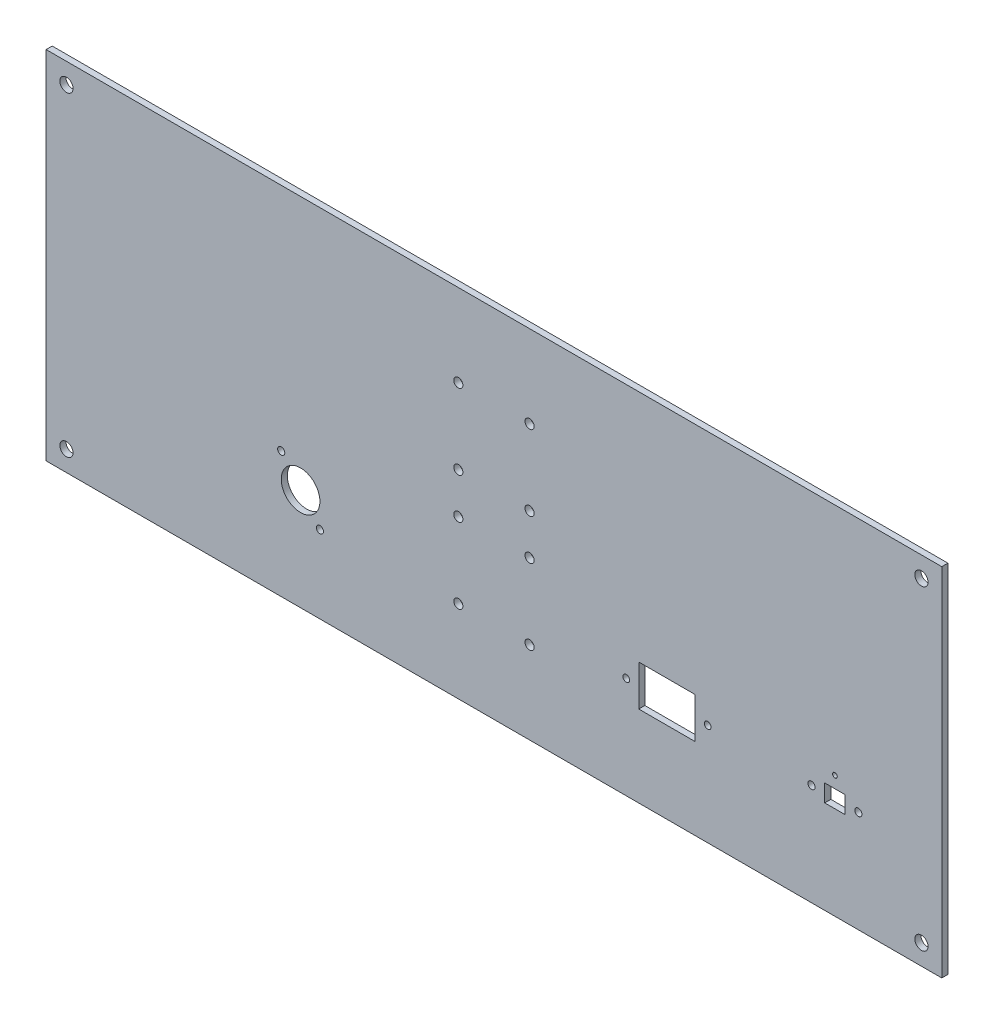
ISO-10303-21;
HEADER;
FILE_DESCRIPTION(('STEP AP214'),'2;1');
FILE_NAME('part.step','',(''),(''),'','','');
FILE_SCHEMA(('AUTOMOTIVE_DESIGN { 1 0 10303 214 1 1 1 1 }'));
ENDSEC;
DATA;
#1=APPLICATION_CONTEXT('core data for automotive mechanical design processes');
#2=APPLICATION_PROTOCOL_DEFINITION('international standard','automotive_design',2000,#1);
#3=PRODUCT_CONTEXT('',#1,'mechanical');
#4=PRODUCT('Part','Part','',(#3));
#5=PRODUCT_RELATED_PRODUCT_CATEGORY('part','',(#4));
#6=PRODUCT_DEFINITION_FORMATION('','',#4);
#7=PRODUCT_DEFINITION_CONTEXT('part definition',#1,'design');
#8=PRODUCT_DEFINITION('design','',#6,#7);
#9=PRODUCT_DEFINITION_SHAPE('','',#8);
#10=(LENGTH_UNIT() NAMED_UNIT(*) SI_UNIT(.MILLI.,.METRE.));
#11=(NAMED_UNIT(*) PLANE_ANGLE_UNIT() SI_UNIT($,.RADIAN.));
#12=(NAMED_UNIT(*) SI_UNIT($,.STERADIAN.) SOLID_ANGLE_UNIT());
#13=UNCERTAINTY_MEASURE_WITH_UNIT(LENGTH_MEASURE(1.E-05),#10,'distance_accuracy_value','');
#14=(GEOMETRIC_REPRESENTATION_CONTEXT(3) GLOBAL_UNCERTAINTY_ASSIGNED_CONTEXT((#13)) GLOBAL_UNIT_ASSIGNED_CONTEXT((#10,
#11,#12)) REPRESENTATION_CONTEXT('',''));
#15=CARTESIAN_POINT('',(0.,0.,0.));
#16=DIRECTION('',(0.,0.,1.));
#17=DIRECTION('',(1.,0.,0.));
#18=AXIS2_PLACEMENT_3D('',#15,#16,#17);
#19=CARTESIAN_POINT('',(0.,0.,3.));
#20=DIRECTION('',(0.,0.,-1.));
#21=DIRECTION('',(-1.,0.,0.));
#22=AXIS2_PLACEMENT_3D('',#19,#20,#21);
#23=PLANE('',#22);
#24=CARTESIAN_POINT('',(325.,50.,3.));
#25=DIRECTION('',(0.,0.,1.));
#26=DIRECTION('',(1.,0.,0.));
#27=AXIS2_PLACEMENT_3D('',#24,#25,#26);
#28=CIRCLE('',#27,1.64999999999999);
#29=CARTESIAN_POINT('',(326.65,50.,3.));
#30=VERTEX_POINT('',#29);
#31=EDGE_CURVE('E164',#30,#30,#28,.T.);
#32=ORIENTED_EDGE('',*,*,#31,.F.);
#33=EDGE_LOOP('',(#32));
#34=FACE_BOUND('',#33,.T.);
#35=CARTESIAN_POINT('',(285.,50.,3.));
#36=DIRECTION('',(0.,0.,1.));
#37=DIRECTION('',(1.,0.,0.));
#38=AXIS2_PLACEMENT_3D('',#35,#36,#37);
#39=CIRCLE('',#38,1.64999999999999);
#40=CARTESIAN_POINT('',(286.65,50.,3.));
#41=VERTEX_POINT('',#40);
#42=EDGE_CURVE('E170',#41,#41,#39,.T.);
#43=ORIENTED_EDGE('',*,*,#42,.F.);
#44=EDGE_LOOP('',(#43));
#45=FACE_BOUND('',#44,.T.);
#46=CARTESIAN_POINT('',(134.5,38.,3.));
#47=DIRECTION('',(0.,0.,1.));
#48=DIRECTION('',(1.,0.,0.));
#49=AXIS2_PLACEMENT_3D('',#46,#47,#48);
#50=CIRCLE('',#49,1.75000000000001);
#51=CARTESIAN_POINT('',(136.25,38.,3.));
#52=VERTEX_POINT('',#51);
#53=EDGE_CURVE('E176',#52,#52,#50,.T.);
#54=ORIENTED_EDGE('',*,*,#53,.F.);
#55=EDGE_LOOP('',(#54));
#56=FACE_BOUND('',#55,.T.);
#57=CARTESIAN_POINT('',(115.5,62.,3.));
#58=DIRECTION('',(0.,0.,1.));
#59=DIRECTION('',(1.,0.,0.));
#60=AXIS2_PLACEMENT_3D('',#57,#58,#59);
#61=CIRCLE('',#60,1.75);
#62=CARTESIAN_POINT('',(117.25,62.,3.));
#63=VERTEX_POINT('',#62);
#64=EDGE_CURVE('E182',#63,#63,#61,.T.);
#65=ORIENTED_EDGE('',*,*,#64,.F.);
#66=EDGE_LOOP('',(#65));
#67=FACE_BOUND('',#66,.T.);
#68=DIRECTION('',(0.,1.,0.));
#69=VECTOR('',#68,1.);
#70=CARTESIAN_POINT('',(318.85,40.,3.));
#71=LINE('',#70,#69);
#72=CARTESIAN_POINT('',(318.85,40.,3.));
#73=VERTEX_POINT('',#72);
#74=CARTESIAN_POINT('',(318.85,60.,3.));
#75=VERTEX_POINT('',#74);
#76=EDGE_CURVE('E188',#73,#75,#71,.T.);
#77=ORIENTED_EDGE('',*,*,#76,.F.);
#78=DIRECTION('',(1.,0.,0.));
#79=VECTOR('',#78,1.);
#80=CARTESIAN_POINT('',(291.15,40.,3.));
#81=LINE('',#80,#79);
#82=CARTESIAN_POINT('',(291.15,40.,3.));
#83=VERTEX_POINT('',#82);
#84=EDGE_CURVE('E196',#83,#73,#81,.T.);
#85=ORIENTED_EDGE('',*,*,#84,.F.);
#86=DIRECTION('',(0.,-1.,0.));
#87=VECTOR('',#86,1.);
#88=CARTESIAN_POINT('',(291.15,40.,3.));
#89=LINE('',#88,#87);
#90=CARTESIAN_POINT('',(291.15,60.,3.));
#91=VERTEX_POINT('',#90);
#92=EDGE_CURVE('E193',#91,#83,#89,.T.);
#93=ORIENTED_EDGE('',*,*,#92,.F.);
#94=DIRECTION('',(-1.,0.,0.));
#95=VECTOR('',#94,1.);
#96=CARTESIAN_POINT('',(291.15,60.,3.));
#97=LINE('',#96,#95);
#98=EDGE_CURVE('E190',#75,#91,#97,.T.);
#99=ORIENTED_EDGE('',*,*,#98,.F.);
#100=EDGE_LOOP('',(#77,#85,#93,#99));
#101=FACE_BOUND('',#100,.T.);
#102=DIRECTION('',(0.,-1.,0.));
#103=VECTOR('',#102,1.);
#104=CARTESIAN_POINT('',(0.,0.,3.));
#105=LINE('',#104,#103);
#106=CARTESIAN_POINT('',(0.,175.,3.));
#107=VERTEX_POINT('',#106);
#108=CARTESIAN_POINT('',(0.,0.,3.));
#109=VERTEX_POINT('',#108);
#110=EDGE_CURVE('E225',#107,#109,#105,.T.);
#111=ORIENTED_EDGE('',*,*,#110,.T.);
#112=DIRECTION('',(1.,0.,0.));
#113=VECTOR('',#112,1.);
#114=CARTESIAN_POINT('',(0.,0.,3.));
#115=LINE('',#114,#113);
#116=CARTESIAN_POINT('',(440.,0.,3.));
#117=VERTEX_POINT('',#116);
#118=EDGE_CURVE('E228',#109,#117,#115,.T.);
#119=ORIENTED_EDGE('',*,*,#118,.T.);
#120=DIRECTION('',(0.,1.,0.));
#121=VECTOR('',#120,1.);
#122=CARTESIAN_POINT('',(440.,0.,3.));
#123=LINE('',#122,#121);
#124=CARTESIAN_POINT('',(440.,175.,3.));
#125=VERTEX_POINT('',#124);
#126=EDGE_CURVE('E231',#117,#125,#123,.T.);
#127=ORIENTED_EDGE('',*,*,#126,.T.);
#128=DIRECTION('',(-1.,0.,0.));
#129=VECTOR('',#128,1.);
#130=CARTESIAN_POINT('',(0.,175.,3.));
#131=LINE('',#130,#129);
#132=EDGE_CURVE('E234',#125,#107,#131,.T.);
#133=ORIENTED_EDGE('',*,*,#132,.T.);
#134=EDGE_LOOP('',(#111,#119,#127,#133));
#135=FACE_BOUND('',#134,.T.);
#136=CARTESIAN_POINT('',(125.,50.,3.));
#137=DIRECTION('',(0.,0.,1.));
#138=DIRECTION('',(1.,0.,0.));
#139=AXIS2_PLACEMENT_3D('',#136,#137,#138);
#140=CIRCLE('',#139,9.50000000000001);
#141=CARTESIAN_POINT('',(134.5,50.,3.));
#142=VERTEX_POINT('',#141);
#143=EDGE_CURVE('E219',#142,#142,#140,.T.);
#144=ORIENTED_EDGE('',*,*,#143,.F.);
#145=EDGE_LOOP('',(#144));
#146=FACE_BOUND('',#145,.T.);
#147=DIRECTION('',(0.,1.,0.));
#148=VECTOR('',#147,1.);
#149=CARTESIAN_POINT('',(392.5,45.75,3.));
#150=LINE('',#149,#148);
#151=CARTESIAN_POINT('',(392.5,45.75,3.));
#152=VERTEX_POINT('',#151);
#153=CARTESIAN_POINT('',(392.5,54.25,3.));
#154=VERTEX_POINT('',#153);
#155=EDGE_CURVE('E125',#152,#154,#150,.T.);
#156=ORIENTED_EDGE('',*,*,#155,.F.);
#157=DIRECTION('',(1.,0.,0.));
#158=VECTOR('',#157,1.);
#159=CARTESIAN_POINT('',(382.5,45.75,3.));
#160=LINE('',#159,#158);
#161=CARTESIAN_POINT('',(382.5,45.75,3.));
#162=VERTEX_POINT('',#161);
#163=EDGE_CURVE('E148',#162,#152,#160,.T.);
#164=ORIENTED_EDGE('',*,*,#163,.F.);
#165=DIRECTION('',(0.,-1.,0.));
#166=VECTOR('',#165,1.);
#167=CARTESIAN_POINT('',(382.5,45.75,3.));
#168=LINE('',#167,#166);
#169=CARTESIAN_POINT('',(382.5,54.25,3.));
#170=VERTEX_POINT('',#169);
#171=EDGE_CURVE('E146',#170,#162,#168,.T.);
#172=ORIENTED_EDGE('',*,*,#171,.F.);
#173=DIRECTION('',(-1.,0.,0.));
#174=VECTOR('',#173,1.);
#175=CARTESIAN_POINT('',(382.5,54.25,3.));
#176=LINE('',#175,#174);
#177=EDGE_CURVE('E133',#154,#170,#176,.T.);
#178=ORIENTED_EDGE('',*,*,#177,.F.);
#179=EDGE_LOOP('',(#156,#164,#172,#178));
#180=FACE_BOUND('',#179,.T.);
#181=CARTESIAN_POINT('',(387.5,60.,3.));
#182=DIRECTION('',(0.,0.,1.));
#183=DIRECTION('',(1.,0.,0.));
#184=AXIS2_PLACEMENT_3D('',#181,#182,#183);
#185=CIRCLE('',#184,1.14999999999996);
#186=CARTESIAN_POINT('',(388.65,60.,3.));
#187=VERTEX_POINT('',#186);
#188=EDGE_CURVE('E154',#187,#187,#185,.T.);
#189=ORIENTED_EDGE('',*,*,#188,.F.);
#190=EDGE_LOOP('',(#189));
#191=FACE_BOUND('',#190,.T.);
#192=CARTESIAN_POINT('',(376.,50.,3.));
#193=DIRECTION('',(0.,0.,1.));
#194=DIRECTION('',(1.,0.,0.));
#195=AXIS2_PLACEMENT_3D('',#192,#193,#194);
#196=CIRCLE('',#195,1.74999999999998);
#197=CARTESIAN_POINT('',(377.75,50.,3.));
#198=VERTEX_POINT('',#197);
#199=EDGE_CURVE('E492',#198,#198,#196,.T.);
#200=ORIENTED_EDGE('',*,*,#199,.F.);
#201=EDGE_LOOP('',(#200));
#202=FACE_BOUND('',#201,.T.);
#203=CARTESIAN_POINT('',(399.,50.,3.));
#204=DIRECTION('',(0.,0.,1.));
#205=DIRECTION('',(1.,0.,0.));
#206=AXIS2_PLACEMENT_3D('',#203,#204,#205);
#207=CIRCLE('',#206,1.74999999999998);
#208=CARTESIAN_POINT('',(400.75,50.,3.));
#209=VERTEX_POINT('',#208);
#210=EDGE_CURVE('E486',#209,#209,#207,.T.);
#211=ORIENTED_EDGE('',*,*,#210,.F.);
#212=EDGE_LOOP('',(#211));
#213=FACE_BOUND('',#212,.T.);
#214=CARTESIAN_POINT('',(10.,165.,3.));
#215=DIRECTION('',(0.,0.,1.));
#216=DIRECTION('',(1.,0.,0.));
#217=AXIS2_PLACEMENT_3D('',#214,#215,#216);
#218=CIRCLE('',#217,3.25);
#219=CARTESIAN_POINT('',(13.25,165.,3.));
#220=VERTEX_POINT('',#219);
#221=EDGE_CURVE('E480',#220,#220,#218,.T.);
#222=ORIENTED_EDGE('',*,*,#221,.F.);
#223=EDGE_LOOP('',(#222));
#224=FACE_BOUND('',#223,.T.);
#225=CARTESIAN_POINT('',(10.,10.,3.));
#226=DIRECTION('',(0.,0.,1.));
#227=DIRECTION('',(1.,0.,0.));
#228=AXIS2_PLACEMENT_3D('',#225,#226,#227);
#229=CIRCLE('',#228,3.25);
#230=CARTESIAN_POINT('',(13.25,10.,3.));
#231=VERTEX_POINT('',#230);
#232=EDGE_CURVE('E474',#231,#231,#229,.T.);
#233=ORIENTED_EDGE('',*,*,#232,.F.);
#234=EDGE_LOOP('',(#233));
#235=FACE_BOUND('',#234,.T.);
#236=CARTESIAN_POINT('',(430.,10.,3.));
#237=DIRECTION('',(0.,0.,1.));
#238=DIRECTION('',(1.,0.,0.));
#239=AXIS2_PLACEMENT_3D('',#236,#237,#238);
#240=CIRCLE('',#239,3.25000000000001);
#241=CARTESIAN_POINT('',(433.25,10.,3.));
#242=VERTEX_POINT('',#241);
#243=EDGE_CURVE('E468',#242,#242,#240,.T.);
#244=ORIENTED_EDGE('',*,*,#243,.F.);
#245=EDGE_LOOP('',(#244));
#246=FACE_BOUND('',#245,.T.);
#247=CARTESIAN_POINT('',(430.,165.,3.));
#248=DIRECTION('',(0.,0.,1.));
#249=DIRECTION('',(1.,0.,0.));
#250=AXIS2_PLACEMENT_3D('',#247,#248,#249);
#251=CIRCLE('',#250,3.25000000000001);
#252=CARTESIAN_POINT('',(433.25,165.,3.));
#253=VERTEX_POINT('',#252);
#254=EDGE_CURVE('E462',#253,#253,#251,.T.);
#255=ORIENTED_EDGE('',*,*,#254,.F.);
#256=EDGE_LOOP('',(#255));
#257=FACE_BOUND('',#256,.T.);
#258=CARTESIAN_POINT('',(202.5,134.5,3.));
#259=DIRECTION('',(0.,0.,1.));
#260=DIRECTION('',(1.,0.,0.));
#261=AXIS2_PLACEMENT_3D('',#258,#259,#260);
#262=CIRCLE('',#261,2.25000000000001);
#263=CARTESIAN_POINT('',(204.75,134.5,3.));
#264=VERTEX_POINT('',#263);
#265=EDGE_CURVE('E456',#264,#264,#262,.T.);
#266=ORIENTED_EDGE('',*,*,#265,.F.);
#267=EDGE_LOOP('',(#266));
#268=FACE_BOUND('',#267,.T.);
#269=CARTESIAN_POINT('',(202.5,97.5,3.));
#270=DIRECTION('',(0.,0.,1.));
#271=DIRECTION('',(1.,0.,0.));
#272=AXIS2_PLACEMENT_3D('',#269,#270,#271);
#273=CIRCLE('',#272,2.25000000000001);
#274=CARTESIAN_POINT('',(204.75,97.5,3.));
#275=VERTEX_POINT('',#274);
#276=EDGE_CURVE('E450',#275,#275,#273,.T.);
#277=ORIENTED_EDGE('',*,*,#276,.F.);
#278=EDGE_LOOP('',(#277));
#279=FACE_BOUND('',#278,.T.);
#280=CARTESIAN_POINT('',(237.5,134.5,3.));
#281=DIRECTION('',(0.,0.,1.));
#282=DIRECTION('',(1.,0.,0.));
#283=AXIS2_PLACEMENT_3D('',#280,#281,#282);
#284=CIRCLE('',#283,2.25000000000001);
#285=CARTESIAN_POINT('',(239.75,134.5,3.));
#286=VERTEX_POINT('',#285);
#287=EDGE_CURVE('E444',#286,#286,#284,.T.);
#288=ORIENTED_EDGE('',*,*,#287,.F.);
#289=EDGE_LOOP('',(#288));
#290=FACE_BOUND('',#289,.T.);
#291=CARTESIAN_POINT('',(237.5,97.5,3.));
#292=DIRECTION('',(0.,0.,1.));
#293=DIRECTION('',(1.,0.,0.));
#294=AXIS2_PLACEMENT_3D('',#291,#292,#293);
#295=CIRCLE('',#294,2.25000000000001);
#296=CARTESIAN_POINT('',(239.75,97.5,3.));
#297=VERTEX_POINT('',#296);
#298=EDGE_CURVE('E438',#297,#297,#295,.T.);
#299=ORIENTED_EDGE('',*,*,#298,.F.);
#300=EDGE_LOOP('',(#299));
#301=FACE_BOUND('',#300,.T.);
#302=CARTESIAN_POINT('',(237.5,77.5,3.));
#303=DIRECTION('',(0.,0.,1.));
#304=DIRECTION('',(1.,0.,0.));
#305=AXIS2_PLACEMENT_3D('',#302,#303,#304);
#306=CIRCLE('',#305,2.25000000000001);
#307=CARTESIAN_POINT('',(239.75,77.5,3.));
#308=VERTEX_POINT('',#307);
#309=EDGE_CURVE('E432',#308,#308,#306,.T.);
#310=ORIENTED_EDGE('',*,*,#309,.F.);
#311=EDGE_LOOP('',(#310));
#312=FACE_BOUND('',#311,.T.);
#313=CARTESIAN_POINT('',(237.5,40.5,3.));
#314=DIRECTION('',(0.,0.,1.));
#315=DIRECTION('',(1.,0.,0.));
#316=AXIS2_PLACEMENT_3D('',#313,#314,#315);
#317=CIRCLE('',#316,2.25000000000001);
#318=CARTESIAN_POINT('',(239.75,40.5,3.));
#319=VERTEX_POINT('',#318);
#320=EDGE_CURVE('E426',#319,#319,#317,.T.);
#321=ORIENTED_EDGE('',*,*,#320,.F.);
#322=EDGE_LOOP('',(#321));
#323=FACE_BOUND('',#322,.T.);
#324=CARTESIAN_POINT('',(202.5,77.5,3.));
#325=DIRECTION('',(0.,0.,1.));
#326=DIRECTION('',(1.,0.,0.));
#327=AXIS2_PLACEMENT_3D('',#324,#325,#326);
#328=CIRCLE('',#327,2.25000000000001);
#329=CARTESIAN_POINT('',(204.75,77.5,3.));
#330=VERTEX_POINT('',#329);
#331=EDGE_CURVE('E420',#330,#330,#328,.T.);
#332=ORIENTED_EDGE('',*,*,#331,.F.);
#333=EDGE_LOOP('',(#332));
#334=FACE_BOUND('',#333,.T.);
#335=CARTESIAN_POINT('',(202.5,40.5,3.));
#336=DIRECTION('',(0.,0.,1.));
#337=DIRECTION('',(1.,0.,0.));
#338=AXIS2_PLACEMENT_3D('',#335,#336,#337);
#339=CIRCLE('',#338,2.25000000000001);
#340=CARTESIAN_POINT('',(204.75,40.5,3.));
#341=VERTEX_POINT('',#340);
#342=EDGE_CURVE('E411',#341,#341,#339,.T.);
#343=ORIENTED_EDGE('',*,*,#342,.F.);
#344=EDGE_LOOP('',(#343));
#345=FACE_BOUND('',#344,.T.);
#346=ADVANCED_FACE('F36',(#34,#45,#56,#67,#101,#135,#146,#180,#191,#202,#213,#224,#235,#246,
#257,#268,#279,#290,#301,#312,#323,#334,#345),#23,.F.);
#347=CARTESIAN_POINT('',(0.,0.,0.));
#348=DIRECTION('',(0.,0.,-1.));
#349=DIRECTION('',(-1.,0.,0.));
#350=AXIS2_PLACEMENT_3D('',#347,#348,#349);
#351=PLANE('',#350);
#352=CARTESIAN_POINT('',(202.5,77.5,0.));
#353=DIRECTION('',(0.,0.,1.));
#354=DIRECTION('',(1.,0.,0.));
#355=AXIS2_PLACEMENT_3D('',#352,#353,#354);
#356=CIRCLE('',#355,2.25000000000001);
#357=CARTESIAN_POINT('',(204.75,77.5,0.));
#358=VERTEX_POINT('',#357);
#359=EDGE_CURVE('E417',#358,#358,#356,.T.);
#360=ORIENTED_EDGE('',*,*,#359,.T.);
#361=EDGE_LOOP('',(#360));
#362=FACE_BOUND('',#361,.T.);
#363=CARTESIAN_POINT('',(237.5,77.5,0.));
#364=DIRECTION('',(0.,0.,1.));
#365=DIRECTION('',(1.,0.,0.));
#366=AXIS2_PLACEMENT_3D('',#363,#364,#365);
#367=CIRCLE('',#366,2.25000000000001);
#368=CARTESIAN_POINT('',(239.75,77.5,0.));
#369=VERTEX_POINT('',#368);
#370=EDGE_CURVE('E429',#369,#369,#367,.T.);
#371=ORIENTED_EDGE('',*,*,#370,.T.);
#372=EDGE_LOOP('',(#371));
#373=FACE_BOUND('',#372,.T.);
#374=CARTESIAN_POINT('',(237.5,134.5,0.));
#375=DIRECTION('',(0.,0.,1.));
#376=DIRECTION('',(1.,0.,0.));
#377=AXIS2_PLACEMENT_3D('',#374,#375,#376);
#378=CIRCLE('',#377,2.25000000000001);
#379=CARTESIAN_POINT('',(239.75,134.5,0.));
#380=VERTEX_POINT('',#379);
#381=EDGE_CURVE('E441',#380,#380,#378,.T.);
#382=ORIENTED_EDGE('',*,*,#381,.T.);
#383=EDGE_LOOP('',(#382));
#384=FACE_BOUND('',#383,.T.);
#385=CARTESIAN_POINT('',(202.5,134.5,0.));
#386=DIRECTION('',(0.,0.,1.));
#387=DIRECTION('',(1.,0.,0.));
#388=AXIS2_PLACEMENT_3D('',#385,#386,#387);
#389=CIRCLE('',#388,2.25000000000001);
#390=CARTESIAN_POINT('',(204.75,134.5,0.));
#391=VERTEX_POINT('',#390);
#392=EDGE_CURVE('E453',#391,#391,#389,.T.);
#393=ORIENTED_EDGE('',*,*,#392,.T.);
#394=EDGE_LOOP('',(#393));
#395=FACE_BOUND('',#394,.T.);
#396=CARTESIAN_POINT('',(430.,10.,0.));
#397=DIRECTION('',(0.,0.,1.));
#398=DIRECTION('',(1.,0.,0.));
#399=AXIS2_PLACEMENT_3D('',#396,#397,#398);
#400=CIRCLE('',#399,3.25000000000001);
#401=CARTESIAN_POINT('',(433.25,10.,0.));
#402=VERTEX_POINT('',#401);
#403=EDGE_CURVE('E465',#402,#402,#400,.T.);
#404=ORIENTED_EDGE('',*,*,#403,.T.);
#405=EDGE_LOOP('',(#404));
#406=FACE_BOUND('',#405,.T.);
#407=CARTESIAN_POINT('',(10.,165.,0.));
#408=DIRECTION('',(0.,0.,1.));
#409=DIRECTION('',(1.,0.,0.));
#410=AXIS2_PLACEMENT_3D('',#407,#408,#409);
#411=CIRCLE('',#410,3.25);
#412=CARTESIAN_POINT('',(13.25,165.,0.));
#413=VERTEX_POINT('',#412);
#414=EDGE_CURVE('E477',#413,#413,#411,.T.);
#415=ORIENTED_EDGE('',*,*,#414,.T.);
#416=EDGE_LOOP('',(#415));
#417=FACE_BOUND('',#416,.T.);
#418=CARTESIAN_POINT('',(376.,50.,0.));
#419=DIRECTION('',(0.,0.,1.));
#420=DIRECTION('',(1.,0.,0.));
#421=AXIS2_PLACEMENT_3D('',#418,#419,#420);
#422=CIRCLE('',#421,1.74999999999998);
#423=CARTESIAN_POINT('',(377.75,50.,0.));
#424=VERTEX_POINT('',#423);
#425=EDGE_CURVE('E489',#424,#424,#422,.T.);
#426=ORIENTED_EDGE('',*,*,#425,.T.);
#427=EDGE_LOOP('',(#426));
#428=FACE_BOUND('',#427,.T.);
#429=DIRECTION('',(1.,0.,0.));
#430=VECTOR('',#429,1.);
#431=CARTESIAN_POINT('',(382.5,45.75,0.));
#432=LINE('',#431,#430);
#433=CARTESIAN_POINT('',(382.5,45.75,0.));
#434=VERTEX_POINT('',#433);
#435=CARTESIAN_POINT('',(392.5,45.75,0.));
#436=VERTEX_POINT('',#435);
#437=EDGE_CURVE('E134',#434,#436,#432,.T.);
#438=ORIENTED_EDGE('',*,*,#437,.T.);
#439=DIRECTION('',(0.,1.,0.));
#440=VECTOR('',#439,1.);
#441=CARTESIAN_POINT('',(392.5,45.75,0.));
#442=LINE('',#441,#440);
#443=CARTESIAN_POINT('',(392.5,54.25,0.));
#444=VERTEX_POINT('',#443);
#445=EDGE_CURVE('E59',#436,#444,#442,.T.);
#446=ORIENTED_EDGE('',*,*,#445,.T.);
#447=DIRECTION('',(-1.,0.,0.));
#448=VECTOR('',#447,1.);
#449=CARTESIAN_POINT('',(382.5,54.25,0.));
#450=LINE('',#449,#448);
#451=CARTESIAN_POINT('',(382.5,54.25,0.));
#452=VERTEX_POINT('',#451);
#453=EDGE_CURVE('E140',#444,#452,#450,.T.);
#454=ORIENTED_EDGE('',*,*,#453,.T.);
#455=DIRECTION('',(0.,-1.,0.));
#456=VECTOR('',#455,1.);
#457=CARTESIAN_POINT('',(382.5,45.75,0.));
#458=LINE('',#457,#456);
#459=EDGE_CURVE('E156',#452,#434,#458,.T.);
#460=ORIENTED_EDGE('',*,*,#459,.T.);
#461=EDGE_LOOP('',(#438,#446,#454,#460));
#462=FACE_BOUND('',#461,.T.);
#463=CARTESIAN_POINT('',(325.,50.,0.));
#464=DIRECTION('',(0.,0.,1.));
#465=DIRECTION('',(1.,0.,0.));
#466=AXIS2_PLACEMENT_3D('',#463,#464,#465);
#467=CIRCLE('',#466,1.64999999999999);
#468=CARTESIAN_POINT('',(326.65,50.,0.));
#469=VERTEX_POINT('',#468);
#470=EDGE_CURVE('E141',#469,#469,#467,.T.);
#471=ORIENTED_EDGE('',*,*,#470,.T.);
#472=EDGE_LOOP('',(#471));
#473=FACE_BOUND('',#472,.T.);
#474=CARTESIAN_POINT('',(134.5,38.,0.));
#475=DIRECTION('',(0.,0.,1.));
#476=DIRECTION('',(1.,0.,0.));
#477=AXIS2_PLACEMENT_3D('',#474,#475,#476);
#478=CIRCLE('',#477,1.75000000000001);
#479=CARTESIAN_POINT('',(136.25,38.,0.));
#480=VERTEX_POINT('',#479);
#481=EDGE_CURVE('E173',#480,#480,#478,.T.);
#482=ORIENTED_EDGE('',*,*,#481,.T.);
#483=EDGE_LOOP('',(#482));
#484=FACE_BOUND('',#483,.T.);
#485=DIRECTION('',(1.,0.,0.));
#486=VECTOR('',#485,1.);
#487=CARTESIAN_POINT('',(291.15,40.,0.));
#488=LINE('',#487,#486);
#489=CARTESIAN_POINT('',(291.15,40.,0.));
#490=VERTEX_POINT('',#489);
#491=CARTESIAN_POINT('',(318.85,40.,0.));
#492=VERTEX_POINT('',#491);
#493=EDGE_CURVE('E191',#490,#492,#488,.T.);
#494=ORIENTED_EDGE('',*,*,#493,.T.);
#495=DIRECTION('',(0.,1.,0.));
#496=VECTOR('',#495,1.);
#497=CARTESIAN_POINT('',(318.85,40.,0.));
#498=LINE('',#497,#496);
#499=CARTESIAN_POINT('',(318.85,60.,0.));
#500=VERTEX_POINT('',#499);
#501=EDGE_CURVE('E185',#492,#500,#498,.T.);
#502=ORIENTED_EDGE('',*,*,#501,.T.);
#503=DIRECTION('',(-1.,0.,0.));
#504=VECTOR('',#503,1.);
#505=CARTESIAN_POINT('',(291.15,60.,0.));
#506=LINE('',#505,#504);
#507=CARTESIAN_POINT('',(291.15,60.,0.));
#508=VERTEX_POINT('',#507);
#509=EDGE_CURVE('E201',#500,#508,#506,.T.);
#510=ORIENTED_EDGE('',*,*,#509,.T.);
#511=DIRECTION('',(0.,-1.,0.));
#512=VECTOR('',#511,1.);
#513=CARTESIAN_POINT('',(291.15,40.,0.));
#514=LINE('',#513,#512);
#515=EDGE_CURVE('E204',#508,#490,#514,.T.);
#516=ORIENTED_EDGE('',*,*,#515,.T.);
#517=EDGE_LOOP('',(#494,#502,#510,#516));
#518=FACE_BOUND('',#517,.T.);
#519=CARTESIAN_POINT('',(125.,50.,0.));
#520=DIRECTION('',(0.,0.,1.));
#521=DIRECTION('',(1.,0.,0.));
#522=AXIS2_PLACEMENT_3D('',#519,#520,#521);
#523=CIRCLE('',#522,9.50000000000001);
#524=CARTESIAN_POINT('',(134.5,50.,0.));
#525=VERTEX_POINT('',#524);
#526=EDGE_CURVE('E218',#525,#525,#523,.T.);
#527=ORIENTED_EDGE('',*,*,#526,.T.);
#528=EDGE_LOOP('',(#527));
#529=FACE_BOUND('',#528,.T.);
#530=DIRECTION('',(0.,-1.,0.));
#531=VECTOR('',#530,1.);
#532=CARTESIAN_POINT('',(0.,0.,0.));
#533=LINE('',#532,#531);
#534=CARTESIAN_POINT('',(0.,175.,0.));
#535=VERTEX_POINT('',#534);
#536=CARTESIAN_POINT('',(0.,0.,0.));
#537=VERTEX_POINT('',#536);
#538=EDGE_CURVE('E222',#535,#537,#533,.T.);
#539=ORIENTED_EDGE('',*,*,#538,.F.);
#540=DIRECTION('',(-1.,0.,0.));
#541=VECTOR('',#540,1.);
#542=CARTESIAN_POINT('',(0.,175.,0.));
#543=LINE('',#542,#541);
#544=CARTESIAN_POINT('',(440.,175.,0.));
#545=VERTEX_POINT('',#544);
#546=EDGE_CURVE('E229',#545,#535,#543,.T.);
#547=ORIENTED_EDGE('',*,*,#546,.F.);
#548=DIRECTION('',(0.,1.,0.));
#549=VECTOR('',#548,1.);
#550=CARTESIAN_POINT('',(440.,0.,0.));
#551=LINE('',#550,#549);
#552=CARTESIAN_POINT('',(440.,0.,0.));
#553=VERTEX_POINT('',#552);
#554=EDGE_CURVE('E241',#553,#545,#551,.T.);
#555=ORIENTED_EDGE('',*,*,#554,.F.);
#556=DIRECTION('',(1.,0.,0.));
#557=VECTOR('',#556,1.);
#558=CARTESIAN_POINT('',(0.,0.,0.));
#559=LINE('',#558,#557);
#560=EDGE_CURVE('E239',#537,#553,#559,.T.);
#561=ORIENTED_EDGE('',*,*,#560,.F.);
#562=EDGE_LOOP('',(#539,#547,#555,#561));
#563=FACE_BOUND('',#562,.T.);
#564=CARTESIAN_POINT('',(115.5,62.,0.));
#565=DIRECTION('',(0.,0.,1.));
#566=DIRECTION('',(1.,0.,0.));
#567=AXIS2_PLACEMENT_3D('',#564,#565,#566);
#568=CIRCLE('',#567,1.75);
#569=CARTESIAN_POINT('',(117.25,62.,0.));
#570=VERTEX_POINT('',#569);
#571=EDGE_CURVE('E179',#570,#570,#568,.T.);
#572=ORIENTED_EDGE('',*,*,#571,.T.);
#573=EDGE_LOOP('',(#572));
#574=FACE_BOUND('',#573,.T.);
#575=CARTESIAN_POINT('',(285.,50.,0.));
#576=DIRECTION('',(0.,0.,1.));
#577=DIRECTION('',(1.,0.,0.));
#578=AXIS2_PLACEMENT_3D('',#575,#576,#577);
#579=CIRCLE('',#578,1.64999999999999);
#580=CARTESIAN_POINT('',(286.65,50.,0.));
#581=VERTEX_POINT('',#580);
#582=EDGE_CURVE('E167',#581,#581,#579,.T.);
#583=ORIENTED_EDGE('',*,*,#582,.T.);
#584=EDGE_LOOP('',(#583));
#585=FACE_BOUND('',#584,.T.);
#586=CARTESIAN_POINT('',(387.5,60.,0.));
#587=DIRECTION('',(0.,0.,1.));
#588=DIRECTION('',(1.,0.,0.));
#589=AXIS2_PLACEMENT_3D('',#586,#587,#588);
#590=CIRCLE('',#589,1.14999999999996);
#591=CARTESIAN_POINT('',(388.65,60.,0.));
#592=VERTEX_POINT('',#591);
#593=EDGE_CURVE('E495',#592,#592,#590,.T.);
#594=ORIENTED_EDGE('',*,*,#593,.T.);
#595=EDGE_LOOP('',(#594));
#596=FACE_BOUND('',#595,.T.);
#597=CARTESIAN_POINT('',(399.,50.,0.));
#598=DIRECTION('',(0.,0.,1.));
#599=DIRECTION('',(1.,0.,0.));
#600=AXIS2_PLACEMENT_3D('',#597,#598,#599);
#601=CIRCLE('',#600,1.74999999999998);
#602=CARTESIAN_POINT('',(400.75,50.,0.));
#603=VERTEX_POINT('',#602);
#604=EDGE_CURVE('E483',#603,#603,#601,.T.);
#605=ORIENTED_EDGE('',*,*,#604,.T.);
#606=EDGE_LOOP('',(#605));
#607=FACE_BOUND('',#606,.T.);
#608=CARTESIAN_POINT('',(10.,10.,0.));
#609=DIRECTION('',(0.,0.,1.));
#610=DIRECTION('',(1.,0.,0.));
#611=AXIS2_PLACEMENT_3D('',#608,#609,#610);
#612=CIRCLE('',#611,3.25);
#613=CARTESIAN_POINT('',(13.25,10.,0.));
#614=VERTEX_POINT('',#613);
#615=EDGE_CURVE('E471',#614,#614,#612,.T.);
#616=ORIENTED_EDGE('',*,*,#615,.T.);
#617=EDGE_LOOP('',(#616));
#618=FACE_BOUND('',#617,.T.);
#619=CARTESIAN_POINT('',(430.,165.,0.));
#620=DIRECTION('',(0.,0.,1.));
#621=DIRECTION('',(1.,0.,0.));
#622=AXIS2_PLACEMENT_3D('',#619,#620,#621);
#623=CIRCLE('',#622,3.25000000000001);
#624=CARTESIAN_POINT('',(433.25,165.,0.));
#625=VERTEX_POINT('',#624);
#626=EDGE_CURVE('E459',#625,#625,#623,.T.);
#627=ORIENTED_EDGE('',*,*,#626,.T.);
#628=EDGE_LOOP('',(#627));
#629=FACE_BOUND('',#628,.T.);
#630=CARTESIAN_POINT('',(202.5,97.5,0.));
#631=DIRECTION('',(0.,0.,1.));
#632=DIRECTION('',(1.,0.,0.));
#633=AXIS2_PLACEMENT_3D('',#630,#631,#632);
#634=CIRCLE('',#633,2.25000000000001);
#635=CARTESIAN_POINT('',(204.75,97.5,0.));
#636=VERTEX_POINT('',#635);
#637=EDGE_CURVE('E447',#636,#636,#634,.T.);
#638=ORIENTED_EDGE('',*,*,#637,.T.);
#639=EDGE_LOOP('',(#638));
#640=FACE_BOUND('',#639,.T.);
#641=CARTESIAN_POINT('',(237.5,97.5,0.));
#642=DIRECTION('',(0.,0.,1.));
#643=DIRECTION('',(1.,0.,0.));
#644=AXIS2_PLACEMENT_3D('',#641,#642,#643);
#645=CIRCLE('',#644,2.25000000000001);
#646=CARTESIAN_POINT('',(239.75,97.5,0.));
#647=VERTEX_POINT('',#646);
#648=EDGE_CURVE('E435',#647,#647,#645,.T.);
#649=ORIENTED_EDGE('',*,*,#648,.T.);
#650=EDGE_LOOP('',(#649));
#651=FACE_BOUND('',#650,.T.);
#652=CARTESIAN_POINT('',(237.5,40.5,0.));
#653=DIRECTION('',(0.,0.,1.));
#654=DIRECTION('',(1.,0.,0.));
#655=AXIS2_PLACEMENT_3D('',#652,#653,#654);
#656=CIRCLE('',#655,2.25000000000001);
#657=CARTESIAN_POINT('',(239.75,40.5,0.));
#658=VERTEX_POINT('',#657);
#659=EDGE_CURVE('E423',#658,#658,#656,.T.);
#660=ORIENTED_EDGE('',*,*,#659,.T.);
#661=EDGE_LOOP('',(#660));
#662=FACE_BOUND('',#661,.T.);
#663=CARTESIAN_POINT('',(202.5,40.5,0.));
#664=DIRECTION('',(0.,0.,1.));
#665=DIRECTION('',(1.,0.,0.));
#666=AXIS2_PLACEMENT_3D('',#663,#664,#665);
#667=CIRCLE('',#666,2.25000000000001);
#668=CARTESIAN_POINT('',(204.75,40.5,0.));
#669=VERTEX_POINT('',#668);
#670=EDGE_CURVE('E414',#669,#669,#667,.T.);
#671=ORIENTED_EDGE('',*,*,#670,.T.);
#672=EDGE_LOOP('',(#671));
#673=FACE_BOUND('',#672,.T.);
#674=ADVANCED_FACE('F260',(#362,#373,#384,#395,#406,#417,#428,#462,#473,#484,#518,#529,#563,
#574,#585,#596,#607,#618,#629,#640,#651,#662,#673),#351,.T.);
#675=CARTESIAN_POINT('',(0.,0.,3.));
#676=DIRECTION('',(1.,0.,0.));
#677=DIRECTION('',(0.,1.,0.));
#678=AXIS2_PLACEMENT_3D('',#675,#676,#677);
#679=PLANE('',#678);
#680=ORIENTED_EDGE('',*,*,#538,.T.);
#681=DIRECTION('',(0.,0.,-1.));
#682=VECTOR('',#681,1.);
#683=CARTESIAN_POINT('',(0.,0.,3.));
#684=LINE('',#683,#682);
#685=EDGE_CURVE('E11',#109,#537,#684,.T.);
#686=ORIENTED_EDGE('',*,*,#685,.F.);
#687=ORIENTED_EDGE('',*,*,#110,.F.);
#688=DIRECTION('',(0.,0.,-1.));
#689=VECTOR('',#688,1.);
#690=CARTESIAN_POINT('',(0.,175.,3.));
#691=LINE('',#690,#689);
#692=EDGE_CURVE('E236',#107,#535,#691,.T.);
#693=ORIENTED_EDGE('',*,*,#692,.T.);
#694=EDGE_LOOP('',(#680,#686,#687,#693));
#695=FACE_BOUND('',#694,.T.);
#696=ADVANCED_FACE('F38',(#695),#679,.F.);
#697=CARTESIAN_POINT('',(0.,0.,3.));
#698=DIRECTION('',(0.,1.,0.));
#699=DIRECTION('',(0.,0.,1.));
#700=AXIS2_PLACEMENT_3D('',#697,#698,#699);
#701=PLANE('',#700);
#702=ORIENTED_EDGE('',*,*,#560,.T.);
#703=DIRECTION('',(0.,0.,-1.));
#704=VECTOR('',#703,1.);
#705=CARTESIAN_POINT('',(440.,0.,3.));
#706=LINE('',#705,#704);
#707=EDGE_CURVE('E44',#117,#553,#706,.T.);
#708=ORIENTED_EDGE('',*,*,#707,.F.);
#709=ORIENTED_EDGE('',*,*,#118,.F.);
#710=ORIENTED_EDGE('',*,*,#685,.T.);
#711=EDGE_LOOP('',(#702,#708,#709,#710));
#712=FACE_BOUND('',#711,.T.);
#713=ADVANCED_FACE('F271',(#712),#701,.F.);
#714=CARTESIAN_POINT('',(440.,0.,3.));
#715=DIRECTION('',(-1.,0.,0.));
#716=DIRECTION('',(0.,0.,1.));
#717=AXIS2_PLACEMENT_3D('',#714,#715,#716);
#718=PLANE('',#717);
#719=ORIENTED_EDGE('',*,*,#554,.T.);
#720=DIRECTION('',(0.,0.,-1.));
#721=VECTOR('',#720,1.);
#722=CARTESIAN_POINT('',(440.,175.,3.));
#723=LINE('',#722,#721);
#724=EDGE_CURVE('E247',#125,#545,#723,.T.);
#725=ORIENTED_EDGE('',*,*,#724,.F.);
#726=ORIENTED_EDGE('',*,*,#126,.F.);
#727=ORIENTED_EDGE('',*,*,#707,.T.);
#728=EDGE_LOOP('',(#719,#725,#726,#727));
#729=FACE_BOUND('',#728,.T.);
#730=ADVANCED_FACE('F254',(#729),#718,.F.);
#731=CARTESIAN_POINT('',(0.,175.,3.));
#732=DIRECTION('',(0.,-1.,0.));
#733=DIRECTION('',(0.,0.,-1.));
#734=AXIS2_PLACEMENT_3D('',#731,#732,#733);
#735=PLANE('',#734);
#736=ORIENTED_EDGE('',*,*,#546,.T.);
#737=ORIENTED_EDGE('',*,*,#692,.F.);
#738=ORIENTED_EDGE('',*,*,#132,.F.);
#739=ORIENTED_EDGE('',*,*,#724,.T.);
#740=EDGE_LOOP('',(#736,#737,#738,#739));
#741=FACE_BOUND('',#740,.T.);
#742=ADVANCED_FACE('F264',(#741),#735,.F.);
#743=CARTESIAN_POINT('',(125.,50.,3.));
#744=DIRECTION('',(0.,0.,-1.));
#745=DIRECTION('',(-1.,0.,0.));
#746=AXIS2_PLACEMENT_3D('',#743,#744,#745);
#747=CYLINDRICAL_SURFACE('',#746,9.50000000000001);
#748=ORIENTED_EDGE('',*,*,#143,.T.);
#749=EDGE_LOOP('',(#748));
#750=FACE_BOUND('',#749,.T.);
#751=ORIENTED_EDGE('',*,*,#526,.F.);
#752=EDGE_LOOP('',(#751));
#753=FACE_BOUND('',#752,.T.);
#754=ADVANCED_FACE('F288',(#750,#753),#747,.F.);
#755=CARTESIAN_POINT('',(318.85,40.,3.));
#756=DIRECTION('',(-1.,0.,0.));
#757=DIRECTION('',(0.,0.,1.));
#758=AXIS2_PLACEMENT_3D('',#755,#756,#757);
#759=PLANE('',#758);
#760=ORIENTED_EDGE('',*,*,#501,.F.);
#761=DIRECTION('',(0.,0.,-1.));
#762=VECTOR('',#761,1.);
#763=CARTESIAN_POINT('',(318.85,40.,3.));
#764=LINE('',#763,#762);
#765=EDGE_CURVE('E198',#73,#492,#764,.T.);
#766=ORIENTED_EDGE('',*,*,#765,.F.);
#767=ORIENTED_EDGE('',*,*,#76,.T.);
#768=DIRECTION('',(0.,0.,-1.));
#769=VECTOR('',#768,1.);
#770=CARTESIAN_POINT('',(318.85,60.,3.));
#771=LINE('',#770,#769);
#772=EDGE_CURVE('E215',#75,#500,#771,.T.);
#773=ORIENTED_EDGE('',*,*,#772,.T.);
#774=EDGE_LOOP('',(#760,#766,#767,#773));
#775=FACE_BOUND('',#774,.T.);
#776=ADVANCED_FACE('F295',(#775),#759,.T.);
#777=CARTESIAN_POINT('',(291.15,60.,3.));
#778=DIRECTION('',(0.,-1.,0.));
#779=DIRECTION('',(0.,0.,-1.));
#780=AXIS2_PLACEMENT_3D('',#777,#778,#779);
#781=PLANE('',#780);
#782=ORIENTED_EDGE('',*,*,#509,.F.);
#783=ORIENTED_EDGE('',*,*,#772,.F.);
#784=ORIENTED_EDGE('',*,*,#98,.T.);
#785=DIRECTION('',(0.,0.,-1.));
#786=VECTOR('',#785,1.);
#787=CARTESIAN_POINT('',(291.15,60.,3.));
#788=LINE('',#787,#786);
#789=EDGE_CURVE('E213',#91,#508,#788,.T.);
#790=ORIENTED_EDGE('',*,*,#789,.T.);
#791=EDGE_LOOP('',(#782,#783,#784,#790));
#792=FACE_BOUND('',#791,.T.);
#793=ADVANCED_FACE('F300',(#792),#781,.T.);
#794=CARTESIAN_POINT('',(291.15,40.,3.));
#795=DIRECTION('',(1.,0.,0.));
#796=DIRECTION('',(0.,0.,-1.));
#797=AXIS2_PLACEMENT_3D('',#794,#795,#796);
#798=PLANE('',#797);
#799=ORIENTED_EDGE('',*,*,#515,.F.);
#800=ORIENTED_EDGE('',*,*,#789,.F.);
#801=ORIENTED_EDGE('',*,*,#92,.T.);
#802=DIRECTION('',(0.,0.,-1.));
#803=VECTOR('',#802,1.);
#804=CARTESIAN_POINT('',(291.15,40.,3.));
#805=LINE('',#804,#803);
#806=EDGE_CURVE('E211',#83,#490,#805,.T.);
#807=ORIENTED_EDGE('',*,*,#806,.T.);
#808=EDGE_LOOP('',(#799,#800,#801,#807));
#809=FACE_BOUND('',#808,.T.);
#810=ADVANCED_FACE('F309',(#809),#798,.T.);
#811=CARTESIAN_POINT('',(291.15,40.,3.));
#812=DIRECTION('',(0.,1.,0.));
#813=DIRECTION('',(0.,0.,1.));
#814=AXIS2_PLACEMENT_3D('',#811,#812,#813);
#815=PLANE('',#814);
#816=ORIENTED_EDGE('',*,*,#493,.F.);
#817=ORIENTED_EDGE('',*,*,#806,.F.);
#818=ORIENTED_EDGE('',*,*,#84,.T.);
#819=ORIENTED_EDGE('',*,*,#765,.T.);
#820=EDGE_LOOP('',(#816,#817,#818,#819));
#821=FACE_BOUND('',#820,.T.);
#822=ADVANCED_FACE('F315',(#821),#815,.T.);
#823=CARTESIAN_POINT('',(115.5,62.,3.));
#824=DIRECTION('',(0.,0.,-1.));
#825=DIRECTION('',(-1.,0.,0.));
#826=AXIS2_PLACEMENT_3D('',#823,#824,#825);
#827=CYLINDRICAL_SURFACE('',#826,1.75);
#828=ORIENTED_EDGE('',*,*,#64,.T.);
#829=EDGE_LOOP('',(#828));
#830=FACE_BOUND('',#829,.T.);
#831=ORIENTED_EDGE('',*,*,#571,.F.);
#832=EDGE_LOOP('',(#831));
#833=FACE_BOUND('',#832,.T.);
#834=ADVANCED_FACE('F319',(#830,#833),#827,.F.);
#835=CARTESIAN_POINT('',(134.5,38.,3.));
#836=DIRECTION('',(0.,0.,-1.));
#837=DIRECTION('',(-1.,0.,0.));
#838=AXIS2_PLACEMENT_3D('',#835,#836,#837);
#839=CYLINDRICAL_SURFACE('',#838,1.75000000000001);
#840=ORIENTED_EDGE('',*,*,#53,.T.);
#841=EDGE_LOOP('',(#840));
#842=FACE_BOUND('',#841,.T.);
#843=ORIENTED_EDGE('',*,*,#481,.F.);
#844=EDGE_LOOP('',(#843));
#845=FACE_BOUND('',#844,.T.);
#846=ADVANCED_FACE('F323',(#842,#845),#839,.F.);
#847=CARTESIAN_POINT('',(285.,50.,3.));
#848=DIRECTION('',(0.,0.,-1.));
#849=DIRECTION('',(-1.,0.,0.));
#850=AXIS2_PLACEMENT_3D('',#847,#848,#849);
#851=CYLINDRICAL_SURFACE('',#850,1.64999999999999);
#852=ORIENTED_EDGE('',*,*,#42,.T.);
#853=EDGE_LOOP('',(#852));
#854=FACE_BOUND('',#853,.T.);
#855=ORIENTED_EDGE('',*,*,#582,.F.);
#856=EDGE_LOOP('',(#855));
#857=FACE_BOUND('',#856,.T.);
#858=ADVANCED_FACE('F327',(#854,#857),#851,.F.);
#859=CARTESIAN_POINT('',(325.,50.,3.));
#860=DIRECTION('',(0.,0.,-1.));
#861=DIRECTION('',(-1.,0.,0.));
#862=AXIS2_PLACEMENT_3D('',#859,#860,#861);
#863=CYLINDRICAL_SURFACE('',#862,1.64999999999999);
#864=ORIENTED_EDGE('',*,*,#31,.T.);
#865=EDGE_LOOP('',(#864));
#866=FACE_BOUND('',#865,.T.);
#867=ORIENTED_EDGE('',*,*,#470,.F.);
#868=EDGE_LOOP('',(#867));
#869=FACE_BOUND('',#868,.T.);
#870=ADVANCED_FACE('F331',(#866,#869),#863,.F.);
#871=CARTESIAN_POINT('',(392.5,45.75,3.));
#872=DIRECTION('',(-1.,0.,0.));
#873=DIRECTION('',(0.,0.,1.));
#874=AXIS2_PLACEMENT_3D('',#871,#872,#873);
#875=PLANE('',#874);
#876=ORIENTED_EDGE('',*,*,#445,.F.);
#877=DIRECTION('',(0.,0.,-1.));
#878=VECTOR('',#877,1.);
#879=CARTESIAN_POINT('',(392.5,45.75,3.));
#880=LINE('',#879,#878);
#881=EDGE_CURVE('E129',#152,#436,#880,.T.);
#882=ORIENTED_EDGE('',*,*,#881,.F.);
#883=ORIENTED_EDGE('',*,*,#155,.T.);
#884=DIRECTION('',(0.,0.,-1.));
#885=VECTOR('',#884,1.);
#886=CARTESIAN_POINT('',(392.5,54.25,3.));
#887=LINE('',#886,#885);
#888=EDGE_CURVE('E128',#154,#444,#887,.T.);
#889=ORIENTED_EDGE('',*,*,#888,.T.);
#890=EDGE_LOOP('',(#876,#882,#883,#889));
#891=FACE_BOUND('',#890,.T.);
#892=ADVANCED_FACE('F127',(#891),#875,.T.);
#893=CARTESIAN_POINT('',(382.5,54.25,3.));
#894=DIRECTION('',(0.,-1.,0.));
#895=DIRECTION('',(0.,0.,-1.));
#896=AXIS2_PLACEMENT_3D('',#893,#894,#895);
#897=PLANE('',#896);
#898=ORIENTED_EDGE('',*,*,#453,.F.);
#899=ORIENTED_EDGE('',*,*,#888,.F.);
#900=ORIENTED_EDGE('',*,*,#177,.T.);
#901=DIRECTION('',(0.,0.,-1.));
#902=VECTOR('',#901,1.);
#903=CARTESIAN_POINT('',(382.5,54.25,3.));
#904=LINE('',#903,#902);
#905=EDGE_CURVE('E142',#170,#452,#904,.T.);
#906=ORIENTED_EDGE('',*,*,#905,.T.);
#907=EDGE_LOOP('',(#898,#899,#900,#906));
#908=FACE_BOUND('',#907,.T.);
#909=ADVANCED_FACE('F137',(#908),#897,.T.);
#910=CARTESIAN_POINT('',(382.5,45.75,3.));
#911=DIRECTION('',(1.,0.,0.));
#912=DIRECTION('',(0.,0.,-1.));
#913=AXIS2_PLACEMENT_3D('',#910,#911,#912);
#914=PLANE('',#913);
#915=ORIENTED_EDGE('',*,*,#459,.F.);
#916=ORIENTED_EDGE('',*,*,#905,.F.);
#917=ORIENTED_EDGE('',*,*,#171,.T.);
#918=DIRECTION('',(0.,0.,-1.));
#919=VECTOR('',#918,1.);
#920=CARTESIAN_POINT('',(382.5,45.75,3.));
#921=LINE('',#920,#919);
#922=EDGE_CURVE('E51',#162,#434,#921,.T.);
#923=ORIENTED_EDGE('',*,*,#922,.T.);
#924=EDGE_LOOP('',(#915,#916,#917,#923));
#925=FACE_BOUND('',#924,.T.);
#926=ADVANCED_FACE('F340',(#925),#914,.T.);
#927=CARTESIAN_POINT('',(382.5,45.75,3.));
#928=DIRECTION('',(0.,1.,0.));
#929=DIRECTION('',(0.,0.,1.));
#930=AXIS2_PLACEMENT_3D('',#927,#928,#929);
#931=PLANE('',#930);
#932=ORIENTED_EDGE('',*,*,#437,.F.);
#933=ORIENTED_EDGE('',*,*,#922,.F.);
#934=ORIENTED_EDGE('',*,*,#163,.T.);
#935=ORIENTED_EDGE('',*,*,#881,.T.);
#936=EDGE_LOOP('',(#932,#933,#934,#935));
#937=FACE_BOUND('',#936,.T.);
#938=ADVANCED_FACE('F343',(#937),#931,.T.);
#939=CARTESIAN_POINT('',(387.5,60.,3.));
#940=DIRECTION('',(0.,0.,-1.));
#941=DIRECTION('',(-1.,0.,0.));
#942=AXIS2_PLACEMENT_3D('',#939,#940,#941);
#943=CYLINDRICAL_SURFACE('',#942,1.14999999999996);
#944=ORIENTED_EDGE('',*,*,#188,.T.);
#945=EDGE_LOOP('',(#944));
#946=FACE_BOUND('',#945,.T.);
#947=ORIENTED_EDGE('',*,*,#593,.F.);
#948=EDGE_LOOP('',(#947));
#949=FACE_BOUND('',#948,.T.);
#950=ADVANCED_FACE('F347',(#946,#949),#943,.F.);
#951=CARTESIAN_POINT('',(376.,50.,3.));
#952=DIRECTION('',(0.,0.,-1.));
#953=DIRECTION('',(-1.,0.,0.));
#954=AXIS2_PLACEMENT_3D('',#951,#952,#953);
#955=CYLINDRICAL_SURFACE('',#954,1.74999999999998);
#956=ORIENTED_EDGE('',*,*,#199,.T.);
#957=EDGE_LOOP('',(#956));
#958=FACE_BOUND('',#957,.T.);
#959=ORIENTED_EDGE('',*,*,#425,.F.);
#960=EDGE_LOOP('',(#959));
#961=FACE_BOUND('',#960,.T.);
#962=ADVANCED_FACE('F350',(#958,#961),#955,.F.);
#963=CARTESIAN_POINT('',(399.,50.,3.));
#964=DIRECTION('',(0.,0.,-1.));
#965=DIRECTION('',(-1.,0.,0.));
#966=AXIS2_PLACEMENT_3D('',#963,#964,#965);
#967=CYLINDRICAL_SURFACE('',#966,1.74999999999998);
#968=ORIENTED_EDGE('',*,*,#210,.T.);
#969=EDGE_LOOP('',(#968));
#970=FACE_BOUND('',#969,.T.);
#971=ORIENTED_EDGE('',*,*,#604,.F.);
#972=EDGE_LOOP('',(#971));
#973=FACE_BOUND('',#972,.T.);
#974=ADVANCED_FACE('F354',(#970,#973),#967,.F.);
#975=CARTESIAN_POINT('',(10.,165.,3.));
#976=DIRECTION('',(0.,0.,-1.));
#977=DIRECTION('',(-1.,0.,0.));
#978=AXIS2_PLACEMENT_3D('',#975,#976,#977);
#979=CYLINDRICAL_SURFACE('',#978,3.25);
#980=ORIENTED_EDGE('',*,*,#221,.T.);
#981=EDGE_LOOP('',(#980));
#982=FACE_BOUND('',#981,.T.);
#983=ORIENTED_EDGE('',*,*,#414,.F.);
#984=EDGE_LOOP('',(#983));
#985=FACE_BOUND('',#984,.T.);
#986=ADVANCED_FACE('F358',(#982,#985),#979,.F.);
#987=CARTESIAN_POINT('',(10.,10.,3.));
#988=DIRECTION('',(0.,0.,-1.));
#989=DIRECTION('',(-1.,0.,0.));
#990=AXIS2_PLACEMENT_3D('',#987,#988,#989);
#991=CYLINDRICAL_SURFACE('',#990,3.25);
#992=ORIENTED_EDGE('',*,*,#232,.T.);
#993=EDGE_LOOP('',(#992));
#994=FACE_BOUND('',#993,.T.);
#995=ORIENTED_EDGE('',*,*,#615,.F.);
#996=EDGE_LOOP('',(#995));
#997=FACE_BOUND('',#996,.T.);
#998=ADVANCED_FACE('F362',(#994,#997),#991,.F.);
#999=CARTESIAN_POINT('',(430.,10.,3.));
#1000=DIRECTION('',(0.,0.,-1.));
#1001=DIRECTION('',(-1.,0.,0.));
#1002=AXIS2_PLACEMENT_3D('',#999,#1000,#1001);
#1003=CYLINDRICAL_SURFACE('',#1002,3.25000000000001);
#1004=ORIENTED_EDGE('',*,*,#243,.T.);
#1005=EDGE_LOOP('',(#1004));
#1006=FACE_BOUND('',#1005,.T.);
#1007=ORIENTED_EDGE('',*,*,#403,.F.);
#1008=EDGE_LOOP('',(#1007));
#1009=FACE_BOUND('',#1008,.T.);
#1010=ADVANCED_FACE('F366',(#1006,#1009),#1003,.F.);
#1011=CARTESIAN_POINT('',(430.,165.,3.));
#1012=DIRECTION('',(0.,0.,-1.));
#1013=DIRECTION('',(-1.,0.,0.));
#1014=AXIS2_PLACEMENT_3D('',#1011,#1012,#1013);
#1015=CYLINDRICAL_SURFACE('',#1014,3.25000000000001);
#1016=ORIENTED_EDGE('',*,*,#254,.T.);
#1017=EDGE_LOOP('',(#1016));
#1018=FACE_BOUND('',#1017,.T.);
#1019=ORIENTED_EDGE('',*,*,#626,.F.);
#1020=EDGE_LOOP('',(#1019));
#1021=FACE_BOUND('',#1020,.T.);
#1022=ADVANCED_FACE('F370',(#1018,#1021),#1015,.F.);
#1023=CARTESIAN_POINT('',(202.5,134.5,3.));
#1024=DIRECTION('',(0.,0.,-1.));
#1025=DIRECTION('',(-1.,0.,0.));
#1026=AXIS2_PLACEMENT_3D('',#1023,#1024,#1025);
#1027=CYLINDRICAL_SURFACE('',#1026,2.25000000000001);
#1028=ORIENTED_EDGE('',*,*,#265,.T.);
#1029=EDGE_LOOP('',(#1028));
#1030=FACE_BOUND('',#1029,.T.);
#1031=ORIENTED_EDGE('',*,*,#392,.F.);
#1032=EDGE_LOOP('',(#1031));
#1033=FACE_BOUND('',#1032,.T.);
#1034=ADVANCED_FACE('F374',(#1030,#1033),#1027,.F.);
#1035=CARTESIAN_POINT('',(202.5,97.5,3.));
#1036=DIRECTION('',(0.,0.,-1.));
#1037=DIRECTION('',(-1.,0.,0.));
#1038=AXIS2_PLACEMENT_3D('',#1035,#1036,#1037);
#1039=CYLINDRICAL_SURFACE('',#1038,2.25000000000001);
#1040=ORIENTED_EDGE('',*,*,#276,.T.);
#1041=EDGE_LOOP('',(#1040));
#1042=FACE_BOUND('',#1041,.T.);
#1043=ORIENTED_EDGE('',*,*,#637,.F.);
#1044=EDGE_LOOP('',(#1043));
#1045=FACE_BOUND('',#1044,.T.);
#1046=ADVANCED_FACE('F378',(#1042,#1045),#1039,.F.);
#1047=CARTESIAN_POINT('',(237.5,134.5,3.));
#1048=DIRECTION('',(0.,0.,-1.));
#1049=DIRECTION('',(-1.,0.,0.));
#1050=AXIS2_PLACEMENT_3D('',#1047,#1048,#1049);
#1051=CYLINDRICAL_SURFACE('',#1050,2.25000000000001);
#1052=ORIENTED_EDGE('',*,*,#287,.T.);
#1053=EDGE_LOOP('',(#1052));
#1054=FACE_BOUND('',#1053,.T.);
#1055=ORIENTED_EDGE('',*,*,#381,.F.);
#1056=EDGE_LOOP('',(#1055));
#1057=FACE_BOUND('',#1056,.T.);
#1058=ADVANCED_FACE('F382',(#1054,#1057),#1051,.F.);
#1059=CARTESIAN_POINT('',(237.5,97.5,3.));
#1060=DIRECTION('',(0.,0.,-1.));
#1061=DIRECTION('',(-1.,0.,0.));
#1062=AXIS2_PLACEMENT_3D('',#1059,#1060,#1061);
#1063=CYLINDRICAL_SURFACE('',#1062,2.25000000000001);
#1064=ORIENTED_EDGE('',*,*,#298,.T.);
#1065=EDGE_LOOP('',(#1064));
#1066=FACE_BOUND('',#1065,.T.);
#1067=ORIENTED_EDGE('',*,*,#648,.F.);
#1068=EDGE_LOOP('',(#1067));
#1069=FACE_BOUND('',#1068,.T.);
#1070=ADVANCED_FACE('F386',(#1066,#1069),#1063,.F.);
#1071=CARTESIAN_POINT('',(237.5,77.5,3.));
#1072=DIRECTION('',(0.,0.,-1.));
#1073=DIRECTION('',(-1.,0.,0.));
#1074=AXIS2_PLACEMENT_3D('',#1071,#1072,#1073);
#1075=CYLINDRICAL_SURFACE('',#1074,2.25000000000001);
#1076=ORIENTED_EDGE('',*,*,#309,.T.);
#1077=EDGE_LOOP('',(#1076));
#1078=FACE_BOUND('',#1077,.T.);
#1079=ORIENTED_EDGE('',*,*,#370,.F.);
#1080=EDGE_LOOP('',(#1079));
#1081=FACE_BOUND('',#1080,.T.);
#1082=ADVANCED_FACE('F390',(#1078,#1081),#1075,.F.);
#1083=CARTESIAN_POINT('',(237.5,40.5,3.));
#1084=DIRECTION('',(0.,0.,-1.));
#1085=DIRECTION('',(-1.,0.,0.));
#1086=AXIS2_PLACEMENT_3D('',#1083,#1084,#1085);
#1087=CYLINDRICAL_SURFACE('',#1086,2.25000000000001);
#1088=ORIENTED_EDGE('',*,*,#320,.T.);
#1089=EDGE_LOOP('',(#1088));
#1090=FACE_BOUND('',#1089,.T.);
#1091=ORIENTED_EDGE('',*,*,#659,.F.);
#1092=EDGE_LOOP('',(#1091));
#1093=FACE_BOUND('',#1092,.T.);
#1094=ADVANCED_FACE('F394',(#1090,#1093),#1087,.F.);
#1095=CARTESIAN_POINT('',(202.5,77.5,3.));
#1096=DIRECTION('',(0.,0.,-1.));
#1097=DIRECTION('',(-1.,0.,0.));
#1098=AXIS2_PLACEMENT_3D('',#1095,#1096,#1097);
#1099=CYLINDRICAL_SURFACE('',#1098,2.25000000000001);
#1100=ORIENTED_EDGE('',*,*,#331,.T.);
#1101=EDGE_LOOP('',(#1100));
#1102=FACE_BOUND('',#1101,.T.);
#1103=ORIENTED_EDGE('',*,*,#359,.F.);
#1104=EDGE_LOOP('',(#1103));
#1105=FACE_BOUND('',#1104,.T.);
#1106=ADVANCED_FACE('F398',(#1102,#1105),#1099,.F.);
#1107=CARTESIAN_POINT('',(202.5,40.5,3.));
#1108=DIRECTION('',(0.,0.,-1.));
#1109=DIRECTION('',(-1.,0.,0.));
#1110=AXIS2_PLACEMENT_3D('',#1107,#1108,#1109);
#1111=CYLINDRICAL_SURFACE('',#1110,2.25000000000001);
#1112=ORIENTED_EDGE('',*,*,#342,.T.);
#1113=EDGE_LOOP('',(#1112));
#1114=FACE_BOUND('',#1113,.T.);
#1115=ORIENTED_EDGE('',*,*,#670,.F.);
#1116=EDGE_LOOP('',(#1115));
#1117=FACE_BOUND('',#1116,.T.);
#1118=ADVANCED_FACE('F402',(#1114,#1117),#1111,.F.);
#1119=CLOSED_SHELL('',(#346,#674,#696,#713,#730,#742,#754,#776,#793,#810,#822,#834,#846,#858,
#870,#892,#909,#926,#938,#950,#962,#974,#986,#998,#1010,#1022,#1034,#1046,#1058,#1070,#1082,
#1094,#1106,#1118));
#1120=MANIFOLD_SOLID_BREP('B2',#1119);
#1121=ADVANCED_BREP_SHAPE_REPRESENTATION('',(#18,#1120),#14);
#1122=SHAPE_DEFINITION_REPRESENTATION(#9,#1121);
ENDSEC;
END-ISO-10303-21;
